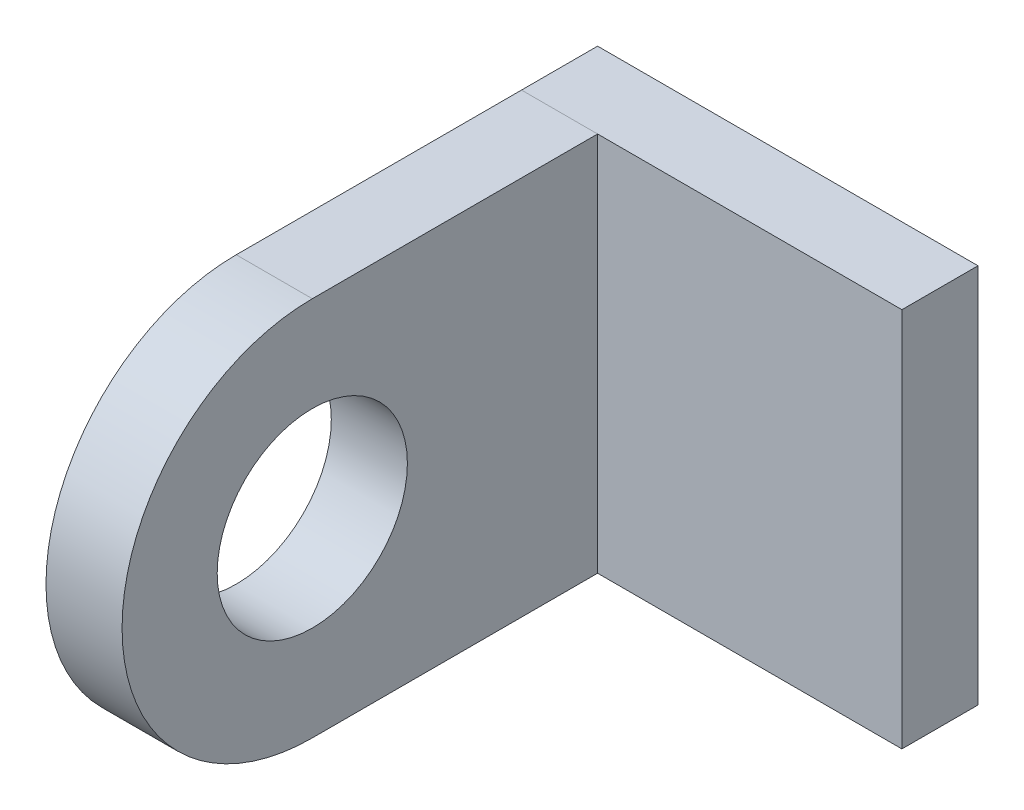
ISO-10303-21;
HEADER;
FILE_DESCRIPTION(('STEP AP214'),'2;1');
FILE_NAME('part.step','',(''),(''),'','','');
FILE_SCHEMA(('AUTOMOTIVE_DESIGN { 1 0 10303 214 1 1 1 1 }'));
ENDSEC;
DATA;
#1=APPLICATION_CONTEXT('core data for automotive mechanical design processes');
#2=APPLICATION_PROTOCOL_DEFINITION('international standard','automotive_design',2000,#1);
#3=PRODUCT_CONTEXT('',#1,'mechanical');
#4=PRODUCT('Part','Part','',(#3));
#5=PRODUCT_RELATED_PRODUCT_CATEGORY('part','',(#4));
#6=PRODUCT_DEFINITION_FORMATION('','',#4);
#7=PRODUCT_DEFINITION_CONTEXT('part definition',#1,'design');
#8=PRODUCT_DEFINITION('design','',#6,#7);
#9=PRODUCT_DEFINITION_SHAPE('','',#8);
#10=(LENGTH_UNIT() NAMED_UNIT(*) SI_UNIT(.MILLI.,.METRE.));
#11=(NAMED_UNIT(*) PLANE_ANGLE_UNIT() SI_UNIT($,.RADIAN.));
#12=(NAMED_UNIT(*) SI_UNIT($,.STERADIAN.) SOLID_ANGLE_UNIT());
#13=UNCERTAINTY_MEASURE_WITH_UNIT(LENGTH_MEASURE(1.E-05),#10,'distance_accuracy_value','');
#14=(GEOMETRIC_REPRESENTATION_CONTEXT(3) GLOBAL_UNCERTAINTY_ASSIGNED_CONTEXT((#13)) GLOBAL_UNIT_ASSIGNED_CONTEXT((#10,
#11,#12)) REPRESENTATION_CONTEXT('',''));
#15=CARTESIAN_POINT('',(0.,0.,0.));
#16=DIRECTION('',(0.,0.,1.));
#17=DIRECTION('',(1.,0.,0.));
#18=AXIS2_PLACEMENT_3D('',#15,#16,#17);
#19=CARTESIAN_POINT('',(-16.,-9.99999999999998,19.));
#20=DIRECTION('',(-1.,0.,0.));
#21=DIRECTION('',(0.,0.,1.));
#22=AXIS2_PLACEMENT_3D('',#19,#20,#21);
#23=CYLINDRICAL_SURFACE('',#22,10.);
#24=CARTESIAN_POINT('',(-20.,-9.99999999999998,19.));
#25=DIRECTION('',(1.,0.,0.));
#26=DIRECTION('',(0.,0.,-1.));
#27=AXIS2_PLACEMENT_3D('',#24,#25,#26);
#28=CIRCLE('',#27,10.);
#29=CARTESIAN_POINT('',(-20.,0.,19.));
#30=VERTEX_POINT('',#29);
#31=CARTESIAN_POINT('',(-20.,-20.,19.));
#32=VERTEX_POINT('',#31);
#33=EDGE_CURVE('E113',#30,#32,#28,.T.);
#34=ORIENTED_EDGE('',*,*,#33,.T.);
#35=DIRECTION('',(-1.,0.,0.));
#36=VECTOR('',#35,1.);
#37=CARTESIAN_POINT('',(-16.,-20.,19.));
#38=LINE('',#37,#36);
#39=CARTESIAN_POINT('',(-16.,-20.,19.));
#40=VERTEX_POINT('',#39);
#41=EDGE_CURVE('E12',#40,#32,#38,.T.);
#42=ORIENTED_EDGE('',*,*,#41,.F.);
#43=CARTESIAN_POINT('',(-16.,-9.99999999999998,19.));
#44=DIRECTION('',(1.,0.,0.));
#45=DIRECTION('',(0.,0.,-1.));
#46=AXIS2_PLACEMENT_3D('',#43,#44,#45);
#47=CIRCLE('',#46,10.);
#48=CARTESIAN_POINT('',(-16.,0.,19.));
#49=VERTEX_POINT('',#48);
#50=EDGE_CURVE('E87',#49,#40,#47,.T.);
#51=ORIENTED_EDGE('',*,*,#50,.F.);
#52=DIRECTION('',(-1.,0.,0.));
#53=VECTOR('',#52,1.);
#54=CARTESIAN_POINT('',(-16.,0.,19.));
#55=LINE('',#54,#53);
#56=EDGE_CURVE('E63',#49,#30,#55,.T.);
#57=ORIENTED_EDGE('',*,*,#56,.T.);
#58=EDGE_LOOP('',(#34,#42,#51,#57));
#59=FACE_BOUND('',#58,.T.);
#60=ADVANCED_FACE('F46',(#59),#23,.T.);
#61=CARTESIAN_POINT('',(-16.,-20.,19.));
#62=DIRECTION('',(0.,-1.,0.));
#63=DIRECTION('',(0.,0.,-1.));
#64=AXIS2_PLACEMENT_3D('',#61,#62,#63);
#65=PLANE('',#64);
#66=DIRECTION('',(0.,0.,1.));
#67=VECTOR('',#66,1.);
#68=CARTESIAN_POINT('',(-20.,-20.,19.));
#69=LINE('',#68,#67);
#70=CARTESIAN_POINT('',(-20.,-20.,4.));
#71=VERTEX_POINT('',#70);
#72=EDGE_CURVE('E96',#71,#32,#69,.T.);
#73=ORIENTED_EDGE('',*,*,#72,.F.);
#74=DIRECTION('',(-1.,0.,0.));
#75=VECTOR('',#74,1.);
#76=CARTESIAN_POINT('',(-16.,-20.,4.));
#77=LINE('',#76,#75);
#78=CARTESIAN_POINT('',(-16.,-20.,4.));
#79=VERTEX_POINT('',#78);
#80=EDGE_CURVE('E55',#79,#71,#77,.T.);
#81=ORIENTED_EDGE('',*,*,#80,.F.);
#82=DIRECTION('',(0.,0.,1.));
#83=VECTOR('',#82,1.);
#84=CARTESIAN_POINT('',(-16.,-20.,19.));
#85=LINE('',#84,#83);
#86=EDGE_CURVE('E94',#79,#40,#85,.T.);
#87=ORIENTED_EDGE('',*,*,#86,.T.);
#88=ORIENTED_EDGE('',*,*,#41,.T.);
#89=EDGE_LOOP('',(#73,#81,#87,#88));
#90=FACE_BOUND('',#89,.T.);
#91=ADVANCED_FACE('F93',(#90),#65,.T.);
#92=CARTESIAN_POINT('',(-16.,-9.99999999999998,4.));
#93=DIRECTION('',(0.,0.,-1.));
#94=DIRECTION('',(-1.,0.,0.));
#95=AXIS2_PLACEMENT_3D('',#92,#93,#94);
#96=PLANE('',#95);
#97=DIRECTION('',(0.,-1.,0.));
#98=VECTOR('',#97,1.);
#99=CARTESIAN_POINT('',(-20.,-9.99999999999998,4.));
#100=LINE('',#99,#98);
#101=CARTESIAN_POINT('',(-20.,0.,4.));
#102=VERTEX_POINT('',#101);
#103=EDGE_CURVE('E116',#102,#71,#100,.T.);
#104=ORIENTED_EDGE('',*,*,#103,.F.);
#105=DIRECTION('',(-1.,0.,0.));
#106=VECTOR('',#105,1.);
#107=CARTESIAN_POINT('',(-16.,0.,4.));
#108=LINE('',#107,#106);
#109=CARTESIAN_POINT('',(-16.,0.,4.));
#110=VERTEX_POINT('',#109);
#111=EDGE_CURVE('E76',#110,#102,#108,.T.);
#112=ORIENTED_EDGE('',*,*,#111,.F.);
#113=DIRECTION('',(0.,-1.,0.));
#114=VECTOR('',#113,1.);
#115=CARTESIAN_POINT('',(-16.,-9.99999999999998,4.));
#116=LINE('',#115,#114);
#117=EDGE_CURVE('E102',#110,#79,#116,.T.);
#118=ORIENTED_EDGE('',*,*,#117,.T.);
#119=ORIENTED_EDGE('',*,*,#80,.T.);
#120=EDGE_LOOP('',(#104,#112,#118,#119));
#121=FACE_BOUND('',#120,.T.);
#122=ADVANCED_FACE('F104',(#121),#96,.T.);
#123=CARTESIAN_POINT('',(-16.,-9.99999999999998,19.));
#124=DIRECTION('',(-1.,0.,0.));
#125=DIRECTION('',(0.,0.,1.));
#126=AXIS2_PLACEMENT_3D('',#123,#124,#125);
#127=CYLINDRICAL_SURFACE('',#126,5.);
#128=CARTESIAN_POINT('',(-16.,-9.99999999999998,19.));
#129=DIRECTION('',(1.,0.,0.));
#130=DIRECTION('',(0.,0.,-1.));
#131=AXIS2_PLACEMENT_3D('',#128,#129,#130);
#132=CIRCLE('',#131,5.);
#133=CARTESIAN_POINT('',(-16.,-9.99999999999998,14.));
#134=VERTEX_POINT('',#133);
#135=EDGE_CURVE('E121',#134,#134,#132,.T.);
#136=ORIENTED_EDGE('',*,*,#135,.T.);
#137=EDGE_LOOP('',(#136));
#138=FACE_BOUND('',#137,.T.);
#139=CARTESIAN_POINT('',(-20.,-9.99999999999998,19.));
#140=DIRECTION('',(1.,0.,0.));
#141=DIRECTION('',(0.,0.,-1.));
#142=AXIS2_PLACEMENT_3D('',#139,#140,#141);
#143=CIRCLE('',#142,5.);
#144=CARTESIAN_POINT('',(-20.,-9.99999999999998,14.));
#145=VERTEX_POINT('',#144);
#146=EDGE_CURVE('E110',#145,#145,#143,.T.);
#147=ORIENTED_EDGE('',*,*,#146,.F.);
#148=EDGE_LOOP('',(#147));
#149=FACE_BOUND('',#148,.T.);
#150=ADVANCED_FACE('F48',(#138,#149),#127,.F.);
#151=CARTESIAN_POINT('',(-16.,0.,19.));
#152=DIRECTION('',(0.,1.,0.));
#153=DIRECTION('',(0.,0.,1.));
#154=AXIS2_PLACEMENT_3D('',#151,#152,#153);
#155=PLANE('',#154);
#156=DIRECTION('',(0.,0.,-1.));
#157=VECTOR('',#156,1.);
#158=CARTESIAN_POINT('',(-20.,0.,19.));
#159=LINE('',#158,#157);
#160=EDGE_CURVE('E118',#30,#102,#159,.T.);
#161=ORIENTED_EDGE('',*,*,#160,.F.);
#162=ORIENTED_EDGE('',*,*,#56,.F.);
#163=DIRECTION('',(0.,0.,-1.));
#164=VECTOR('',#163,1.);
#165=CARTESIAN_POINT('',(-16.,0.,19.));
#166=LINE('',#165,#164);
#167=EDGE_CURVE('E105',#49,#110,#166,.T.);
#168=ORIENTED_EDGE('',*,*,#167,.T.);
#169=ORIENTED_EDGE('',*,*,#111,.T.);
#170=EDGE_LOOP('',(#161,#162,#168,#169));
#171=FACE_BOUND('',#170,.T.);
#172=ADVANCED_FACE('F132',(#171),#155,.T.);
#173=CARTESIAN_POINT('',(-16.,-9.99999999999998,19.));
#174=DIRECTION('',(1.,0.,0.));
#175=DIRECTION('',(0.,0.,-1.));
#176=AXIS2_PLACEMENT_3D('',#173,#174,#175);
#177=PLANE('',#176);
#178=ORIENTED_EDGE('',*,*,#135,.F.);
#179=EDGE_LOOP('',(#178));
#180=FACE_BOUND('',#179,.T.);
#181=ORIENTED_EDGE('',*,*,#50,.T.);
#182=ORIENTED_EDGE('',*,*,#86,.F.);
#183=ORIENTED_EDGE('',*,*,#117,.F.);
#184=ORIENTED_EDGE('',*,*,#167,.F.);
#185=EDGE_LOOP('',(#181,#182,#183,#184));
#186=FACE_BOUND('',#185,.T.);
#187=ADVANCED_FACE('F101',(#180,#186),#177,.T.);
#188=CARTESIAN_POINT('',(-20.,-9.99999999999998,19.));
#189=DIRECTION('',(1.,0.,0.));
#190=DIRECTION('',(0.,0.,-1.));
#191=AXIS2_PLACEMENT_3D('',#188,#189,#190);
#192=PLANE('',#191);
#193=ORIENTED_EDGE('',*,*,#146,.T.);
#194=EDGE_LOOP('',(#193));
#195=FACE_BOUND('',#194,.T.);
#196=ORIENTED_EDGE('',*,*,#33,.F.);
#197=ORIENTED_EDGE('',*,*,#160,.T.);
#198=ORIENTED_EDGE('',*,*,#103,.T.);
#199=ORIENTED_EDGE('',*,*,#72,.T.);
#200=EDGE_LOOP('',(#196,#197,#198,#199));
#201=FACE_BOUND('',#200,.T.);
#202=ADVANCED_FACE('F131',(#195,#201),#192,.F.);
#203=CLOSED_SHELL('',(#60,#91,#122,#150,#172,#187,#202));
#204=MANIFOLD_SOLID_BREP('B2',#203);
#205=CARTESIAN_POINT('',(-20.,0.,4.));
#206=DIRECTION('',(1.,0.,0.));
#207=DIRECTION('',(0.,0.,-1.));
#208=AXIS2_PLACEMENT_3D('',#205,#206,#207);
#209=PLANE('',#208);
#210=DIRECTION('',(0.,-1.,0.));
#211=VECTOR('',#210,1.);
#212=CARTESIAN_POINT('',(-20.,0.,0.));
#213=LINE('',#212,#211);
#214=CARTESIAN_POINT('',(-20.,0.,0.));
#215=VERTEX_POINT('',#214);
#216=CARTESIAN_POINT('',(-20.,-20.,0.));
#217=VERTEX_POINT('',#216);
#218=EDGE_CURVE('E260',#215,#217,#213,.T.);
#219=ORIENTED_EDGE('',*,*,#218,.T.);
#220=DIRECTION('',(0.,0.,-1.));
#221=VECTOR('',#220,1.);
#222=CARTESIAN_POINT('',(-20.,-20.,4.));
#223=LINE('',#222,#221);
#224=CARTESIAN_POINT('',(-20.,-20.,4.));
#225=VERTEX_POINT('',#224);
#226=EDGE_CURVE('E44',#225,#217,#223,.T.);
#227=ORIENTED_EDGE('',*,*,#226,.F.);
#228=DIRECTION('',(0.,-1.,0.));
#229=VECTOR('',#228,1.);
#230=CARTESIAN_POINT('',(-20.,0.,4.));
#231=LINE('',#230,#229);
#232=CARTESIAN_POINT('',(-20.,0.,4.));
#233=VERTEX_POINT('',#232);
#234=EDGE_CURVE('E248',#233,#225,#231,.T.);
#235=ORIENTED_EDGE('',*,*,#234,.F.);
#236=DIRECTION('',(0.,0.,-1.));
#237=VECTOR('',#236,1.);
#238=CARTESIAN_POINT('',(-20.,0.,4.));
#239=LINE('',#238,#237);
#240=EDGE_CURVE('E256',#233,#215,#239,.T.);
#241=ORIENTED_EDGE('',*,*,#240,.T.);
#242=EDGE_LOOP('',(#219,#227,#235,#241));
#243=FACE_BOUND('',#242,.T.);
#244=ADVANCED_FACE('F197',(#243),#209,.F.);
#245=CARTESIAN_POINT('',(-20.,-20.,4.));
#246=DIRECTION('',(0.,1.,0.));
#247=DIRECTION('',(0.,0.,1.));
#248=AXIS2_PLACEMENT_3D('',#245,#246,#247);
#249=PLANE('',#248);
#250=DIRECTION('',(1.,0.,0.));
#251=VECTOR('',#250,1.);
#252=CARTESIAN_POINT('',(-20.,-20.,0.));
#253=LINE('',#252,#251);
#254=CARTESIAN_POINT('',(0.,-20.,0.));
#255=VERTEX_POINT('',#254);
#256=EDGE_CURVE('E252',#217,#255,#253,.T.);
#257=ORIENTED_EDGE('',*,*,#256,.T.);
#258=DIRECTION('',(0.,0.,-1.));
#259=VECTOR('',#258,1.);
#260=CARTESIAN_POINT('',(0.,-20.,4.));
#261=LINE('',#260,#259);
#262=CARTESIAN_POINT('',(0.,-20.,4.));
#263=VERTEX_POINT('',#262);
#264=EDGE_CURVE('E205',#263,#255,#261,.T.);
#265=ORIENTED_EDGE('',*,*,#264,.F.);
#266=DIRECTION('',(1.,0.,0.));
#267=VECTOR('',#266,1.);
#268=CARTESIAN_POINT('',(-20.,-20.,4.));
#269=LINE('',#268,#267);
#270=EDGE_CURVE('E243',#225,#263,#269,.T.);
#271=ORIENTED_EDGE('',*,*,#270,.F.);
#272=ORIENTED_EDGE('',*,*,#226,.T.);
#273=EDGE_LOOP('',(#257,#265,#271,#272));
#274=FACE_BOUND('',#273,.T.);
#275=ADVANCED_FACE('F251',(#274),#249,.F.);
#276=CARTESIAN_POINT('',(0.,0.,4.));
#277=DIRECTION('',(-1.,0.,0.));
#278=DIRECTION('',(0.,0.,1.));
#279=AXIS2_PLACEMENT_3D('',#276,#277,#278);
#280=PLANE('',#279);
#281=DIRECTION('',(0.,1.,0.));
#282=VECTOR('',#281,1.);
#283=CARTESIAN_POINT('',(0.,0.,0.));
#284=LINE('',#283,#282);
#285=CARTESIAN_POINT('',(0.,0.,0.));
#286=VERTEX_POINT('',#285);
#287=EDGE_CURVE('E230',#255,#286,#284,.T.);
#288=ORIENTED_EDGE('',*,*,#287,.T.);
#289=DIRECTION('',(0.,0.,-1.));
#290=VECTOR('',#289,1.);
#291=CARTESIAN_POINT('',(0.,0.,4.));
#292=LINE('',#291,#290);
#293=CARTESIAN_POINT('',(0.,0.,4.));
#294=VERTEX_POINT('',#293);
#295=EDGE_CURVE('E253',#294,#286,#292,.T.);
#296=ORIENTED_EDGE('',*,*,#295,.F.);
#297=DIRECTION('',(0.,1.,0.));
#298=VECTOR('',#297,1.);
#299=CARTESIAN_POINT('',(0.,0.,4.));
#300=LINE('',#299,#298);
#301=EDGE_CURVE('E246',#263,#294,#300,.T.);
#302=ORIENTED_EDGE('',*,*,#301,.F.);
#303=ORIENTED_EDGE('',*,*,#264,.T.);
#304=EDGE_LOOP('',(#288,#296,#302,#303));
#305=FACE_BOUND('',#304,.T.);
#306=ADVANCED_FACE('F254',(#305),#280,.F.);
#307=CARTESIAN_POINT('',(-20.,0.,4.));
#308=DIRECTION('',(0.,-1.,0.));
#309=DIRECTION('',(0.,0.,-1.));
#310=AXIS2_PLACEMENT_3D('',#307,#308,#309);
#311=PLANE('',#310);
#312=DIRECTION('',(-1.,0.,0.));
#313=VECTOR('',#312,1.);
#314=CARTESIAN_POINT('',(-20.,0.,0.));
#315=LINE('',#314,#313);
#316=EDGE_CURVE('E236',#286,#215,#315,.T.);
#317=ORIENTED_EDGE('',*,*,#316,.T.);
#318=ORIENTED_EDGE('',*,*,#240,.F.);
#319=DIRECTION('',(-1.,0.,0.));
#320=VECTOR('',#319,1.);
#321=CARTESIAN_POINT('',(-20.,0.,4.));
#322=LINE('',#321,#320);
#323=EDGE_CURVE('E213',#294,#233,#322,.T.);
#324=ORIENTED_EDGE('',*,*,#323,.F.);
#325=ORIENTED_EDGE('',*,*,#295,.T.);
#326=EDGE_LOOP('',(#317,#318,#324,#325));
#327=FACE_BOUND('',#326,.T.);
#328=ADVANCED_FACE('F267',(#327),#311,.F.);
#329=CARTESIAN_POINT('',(0.,0.,4.));
#330=DIRECTION('',(0.,0.,1.));
#331=DIRECTION('',(1.,0.,0.));
#332=AXIS2_PLACEMENT_3D('',#329,#330,#331);
#333=PLANE('',#332);
#334=ORIENTED_EDGE('',*,*,#234,.T.);
#335=ORIENTED_EDGE('',*,*,#270,.T.);
#336=ORIENTED_EDGE('',*,*,#301,.T.);
#337=ORIENTED_EDGE('',*,*,#323,.T.);
#338=EDGE_LOOP('',(#334,#335,#336,#337));
#339=FACE_BOUND('',#338,.T.);
#340=ADVANCED_FACE('F244',(#339),#333,.T.);
#341=CARTESIAN_POINT('',(0.,0.,0.));
#342=DIRECTION('',(0.,0.,1.));
#343=DIRECTION('',(1.,0.,0.));
#344=AXIS2_PLACEMENT_3D('',#341,#342,#343);
#345=PLANE('',#344);
#346=ORIENTED_EDGE('',*,*,#218,.F.);
#347=ORIENTED_EDGE('',*,*,#316,.F.);
#348=ORIENTED_EDGE('',*,*,#287,.F.);
#349=ORIENTED_EDGE('',*,*,#256,.F.);
#350=EDGE_LOOP('',(#346,#347,#348,#349));
#351=FACE_BOUND('',#350,.T.);
#352=ADVANCED_FACE('F270',(#351),#345,.F.);
#353=CLOSED_SHELL('',(#244,#275,#306,#328,#340,#352));
#354=MANIFOLD_SOLID_BREP('B6',#353);
#355=ADVANCED_BREP_SHAPE_REPRESENTATION('',(#18,#204,#354),#14);
#356=SHAPE_DEFINITION_REPRESENTATION(#9,#355);
ENDSEC;
END-ISO-10303-21;
